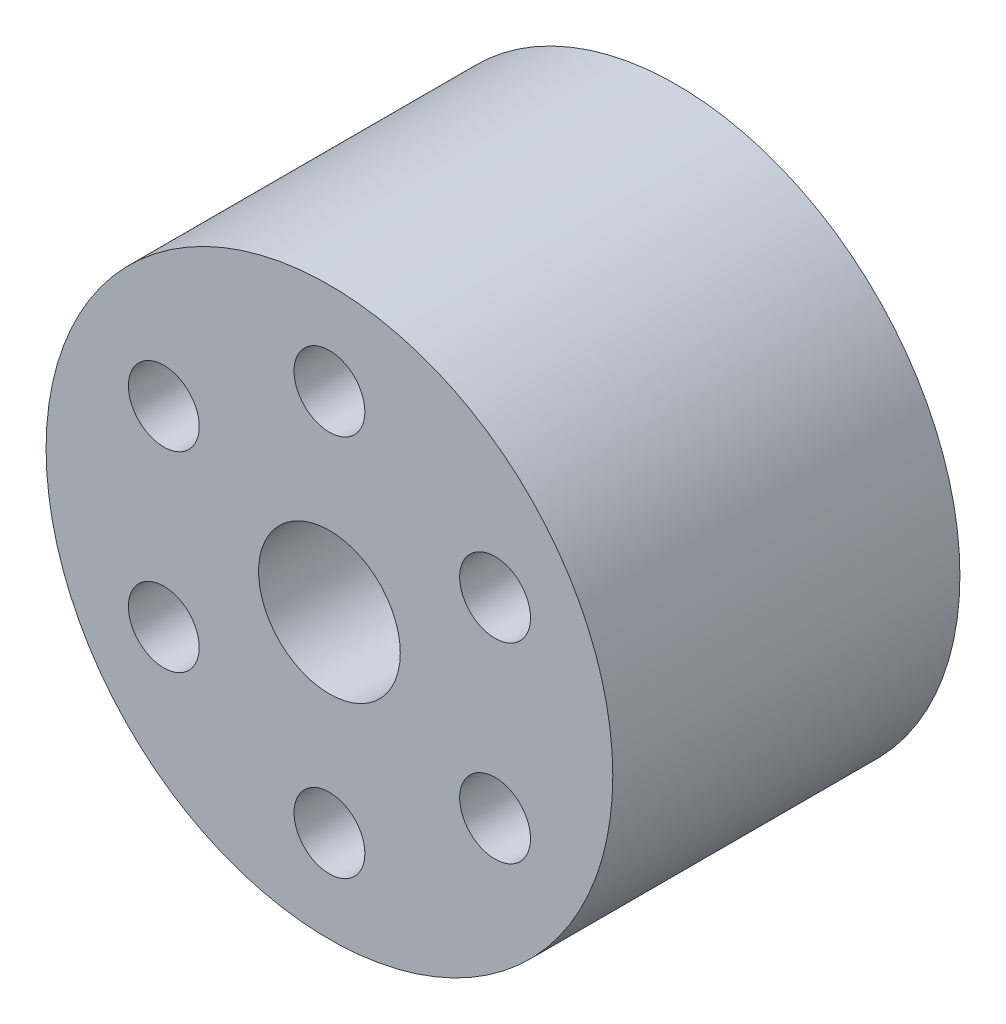
ISO-10303-21;
HEADER;
FILE_DESCRIPTION(('STEP AP214'),'2;1');
FILE_NAME('part.step','',(''),(''),'','','');
FILE_SCHEMA(('AUTOMOTIVE_DESIGN { 1 0 10303 214 1 1 1 1 }'));
ENDSEC;
DATA;
#1=APPLICATION_CONTEXT('core data for automotive mechanical design processes');
#2=APPLICATION_PROTOCOL_DEFINITION('international standard','automotive_design',2000,#1);
#3=PRODUCT_CONTEXT('',#1,'mechanical');
#4=PRODUCT('Part','Part','',(#3));
#5=PRODUCT_RELATED_PRODUCT_CATEGORY('part','',(#4));
#6=PRODUCT_DEFINITION_FORMATION('','',#4);
#7=PRODUCT_DEFINITION_CONTEXT('part definition',#1,'design');
#8=PRODUCT_DEFINITION('design','',#6,#7);
#9=PRODUCT_DEFINITION_SHAPE('','',#8);
#10=(LENGTH_UNIT() NAMED_UNIT(*) SI_UNIT(.MILLI.,.METRE.));
#11=(NAMED_UNIT(*) PLANE_ANGLE_UNIT() SI_UNIT($,.RADIAN.));
#12=(NAMED_UNIT(*) SI_UNIT($,.STERADIAN.) SOLID_ANGLE_UNIT());
#13=UNCERTAINTY_MEASURE_WITH_UNIT(LENGTH_MEASURE(1.E-05),#10,'distance_accuracy_value','');
#14=(GEOMETRIC_REPRESENTATION_CONTEXT(3) GLOBAL_UNCERTAINTY_ASSIGNED_CONTEXT((#13)) GLOBAL_UNIT_ASSIGNED_CONTEXT((#10,
#11,#12)) REPRESENTATION_CONTEXT('',''));
#15=CARTESIAN_POINT('',(0.,0.,0.));
#16=DIRECTION('',(0.,0.,1.));
#17=DIRECTION('',(1.,0.,0.));
#18=AXIS2_PLACEMENT_3D('',#15,#16,#17);
#19=CARTESIAN_POINT('',(0.,0.,24.5));
#20=DIRECTION('',(0.,0.,-1.));
#21=DIRECTION('',(-1.,0.,0.));
#22=AXIS2_PLACEMENT_3D('',#19,#20,#21);
#23=CYLINDRICAL_SURFACE('',#22,20.);
#24=CARTESIAN_POINT('',(0.,0.,24.5));
#25=DIRECTION('',(0.,0.,1.));
#26=DIRECTION('',(1.,0.,0.));
#27=AXIS2_PLACEMENT_3D('',#24,#25,#26);
#28=CIRCLE('',#27,20.);
#29=CARTESIAN_POINT('',(20.,0.,24.5));
#30=VERTEX_POINT('',#29);
#31=EDGE_CURVE('E10',#30,#30,#28,.T.);
#32=ORIENTED_EDGE('',*,*,#31,.F.);
#33=EDGE_LOOP('',(#32));
#34=FACE_BOUND('',#33,.T.);
#35=CARTESIAN_POINT('',(0.,0.,0.));
#36=DIRECTION('',(0.,0.,1.));
#37=DIRECTION('',(1.,0.,0.));
#38=AXIS2_PLACEMENT_3D('',#35,#36,#37);
#39=CIRCLE('',#38,20.);
#40=CARTESIAN_POINT('',(20.,0.,0.));
#41=VERTEX_POINT('',#40);
#42=EDGE_CURVE('E33',#41,#41,#39,.T.);
#43=ORIENTED_EDGE('',*,*,#42,.T.);
#44=EDGE_LOOP('',(#43));
#45=FACE_BOUND('',#44,.T.);
#46=ADVANCED_FACE('F30',(#34,#45),#23,.T.);
#47=CARTESIAN_POINT('',(0.,0.,24.5));
#48=DIRECTION('',(0.,0.,1.));
#49=DIRECTION('',(1.,0.,0.));
#50=AXIS2_PLACEMENT_3D('',#47,#48,#49);
#51=PLANE('',#50);
#52=CARTESIAN_POINT('',(-11.6913429510896,6.74999999999949,24.5));
#53=DIRECTION('',(0.,0.,1.));
#54=DIRECTION('',(1.,0.,0.));
#55=AXIS2_PLACEMENT_3D('',#52,#53,#54);
#56=CIRCLE('',#55,2.50000000000058);
#57=CARTESIAN_POINT('',(-9.19134295108906,6.74999999999949,24.5));
#58=VERTEX_POINT('',#57);
#59=EDGE_CURVE('E84',#58,#58,#56,.T.);
#60=ORIENTED_EDGE('',*,*,#59,.F.);
#61=EDGE_LOOP('',(#60));
#62=FACE_BOUND('',#61,.T.);
#63=CARTESIAN_POINT('',(-11.6913429510891,-6.7500000000005,24.5));
#64=DIRECTION('',(0.,0.,1.));
#65=DIRECTION('',(1.,0.,0.));
#66=AXIS2_PLACEMENT_3D('',#63,#64,#65);
#67=CIRCLE('',#66,2.50000000000109);
#68=CARTESIAN_POINT('',(-9.19134295108796,-6.7500000000005,24.5));
#69=VERTEX_POINT('',#68);
#70=EDGE_CURVE('E78',#69,#69,#67,.T.);
#71=ORIENTED_EDGE('',*,*,#70,.F.);
#72=EDGE_LOOP('',(#71));
#73=FACE_BOUND('',#72,.T.);
#74=CARTESIAN_POINT('',(1.14777268557366E-12,-13.5,24.5));
#75=DIRECTION('',(0.,0.,1.));
#76=DIRECTION('',(1.,0.,0.));
#77=AXIS2_PLACEMENT_3D('',#74,#75,#76);
#78=CIRCLE('',#77,2.50000000000119);
#79=CARTESIAN_POINT('',(2.50000000000234,-13.5,24.5));
#80=VERTEX_POINT('',#79);
#81=EDGE_CURVE('E72',#80,#80,#78,.T.);
#82=ORIENTED_EDGE('',*,*,#81,.F.);
#83=EDGE_LOOP('',(#82));
#84=FACE_BOUND('',#83,.T.);
#85=CARTESIAN_POINT('',(11.6913429510908,-6.7499999999995,24.5));
#86=DIRECTION('',(0.,0.,1.));
#87=DIRECTION('',(1.,0.,0.));
#88=AXIS2_PLACEMENT_3D('',#85,#86,#87);
#89=CIRCLE('',#88,2.50000000000074);
#90=CARTESIAN_POINT('',(14.1913429510915,-6.7499999999995,24.5));
#91=VERTEX_POINT('',#90);
#92=EDGE_CURVE('E66',#91,#91,#89,.T.);
#93=ORIENTED_EDGE('',*,*,#92,.F.);
#94=EDGE_LOOP('',(#93));
#95=FACE_BOUND('',#94,.T.);
#96=CARTESIAN_POINT('',(11.6913429510902,6.7500000000005,24.5));
#97=DIRECTION('',(0.,0.,1.));
#98=DIRECTION('',(1.,0.,0.));
#99=AXIS2_PLACEMENT_3D('',#96,#97,#98);
#100=CIRCLE('',#99,2.50000000000017);
#101=CARTESIAN_POINT('',(14.1913429510904,6.7500000000005,24.5));
#102=VERTEX_POINT('',#101);
#103=EDGE_CURVE('E60',#102,#102,#100,.T.);
#104=ORIENTED_EDGE('',*,*,#103,.F.);
#105=EDGE_LOOP('',(#104));
#106=FACE_BOUND('',#105,.T.);
#107=CARTESIAN_POINT('',(0.,13.5,24.5));
#108=DIRECTION('',(0.,0.,1.));
#109=DIRECTION('',(1.,0.,0.));
#110=AXIS2_PLACEMENT_3D('',#107,#108,#109);
#111=CIRCLE('',#110,2.5);
#112=CARTESIAN_POINT('',(2.5,13.5,24.5));
#113=VERTEX_POINT('',#112);
#114=EDGE_CURVE('E54',#113,#113,#111,.T.);
#115=ORIENTED_EDGE('',*,*,#114,.F.);
#116=EDGE_LOOP('',(#115));
#117=FACE_BOUND('',#116,.T.);
#118=CARTESIAN_POINT('',(0.,0.,24.5));
#119=DIRECTION('',(0.,0.,1.));
#120=DIRECTION('',(1.,0.,0.));
#121=AXIS2_PLACEMENT_3D('',#118,#119,#120);
#122=CIRCLE('',#121,5.);
#123=CARTESIAN_POINT('',(5.,0.,24.5));
#124=VERTEX_POINT('',#123);
#125=EDGE_CURVE('E42',#124,#124,#122,.T.);
#126=ORIENTED_EDGE('',*,*,#125,.F.);
#127=EDGE_LOOP('',(#126));
#128=FACE_BOUND('',#127,.T.);
#129=ORIENTED_EDGE('',*,*,#31,.T.);
#130=EDGE_LOOP('',(#129));
#131=FACE_BOUND('',#130,.T.);
#132=ADVANCED_FACE('F99',(#62,#73,#84,#95,#106,#117,#128,#131),#51,.T.);
#133=CARTESIAN_POINT('',(0.,0.,0.));
#134=DIRECTION('',(0.,0.,1.));
#135=DIRECTION('',(1.,0.,0.));
#136=AXIS2_PLACEMENT_3D('',#133,#134,#135);
#137=PLANE('',#136);
#138=CARTESIAN_POINT('',(0.,0.,0.));
#139=DIRECTION('',(0.,0.,1.));
#140=DIRECTION('',(1.,0.,0.));
#141=AXIS2_PLACEMENT_3D('',#138,#139,#140);
#142=CIRCLE('',#141,4.);
#143=CARTESIAN_POINT('',(4.,0.,0.));
#144=VERTEX_POINT('',#143);
#145=EDGE_CURVE('E45',#144,#144,#142,.T.);
#146=ORIENTED_EDGE('',*,*,#145,.T.);
#147=EDGE_LOOP('',(#146));
#148=FACE_BOUND('',#147,.T.);
#149=ORIENTED_EDGE('',*,*,#42,.F.);
#150=EDGE_LOOP('',(#149));
#151=FACE_BOUND('',#150,.T.);
#152=ADVANCED_FACE('F102',(#148,#151),#137,.F.);
#153=CARTESIAN_POINT('',(0.,0.,14.5));
#154=DIRECTION('',(0.,0.,1.));
#155=DIRECTION('',(1.,0.,0.));
#156=AXIS2_PLACEMENT_3D('',#153,#154,#155);
#157=CYLINDRICAL_SURFACE('',#156,5.);
#158=CARTESIAN_POINT('',(0.,0.,14.5));
#159=DIRECTION('',(0.,0.,1.));
#160=DIRECTION('',(1.,0.,0.));
#161=AXIS2_PLACEMENT_3D('',#158,#159,#160);
#162=CIRCLE('',#161,5.);
#163=CARTESIAN_POINT('',(5.,0.,14.5));
#164=VERTEX_POINT('',#163);
#165=EDGE_CURVE('E40',#164,#164,#162,.T.);
#166=ORIENTED_EDGE('',*,*,#165,.F.);
#167=EDGE_LOOP('',(#166));
#168=FACE_BOUND('',#167,.T.);
#169=ORIENTED_EDGE('',*,*,#125,.T.);
#170=EDGE_LOOP('',(#169));
#171=FACE_BOUND('',#170,.T.);
#172=ADVANCED_FACE('F116',(#168,#171),#157,.F.);
#173=CARTESIAN_POINT('',(0.,0.,14.5));
#174=DIRECTION('',(0.,0.,1.));
#175=DIRECTION('',(1.,0.,0.));
#176=AXIS2_PLACEMENT_3D('',#173,#174,#175);
#177=PLANE('',#176);
#178=CARTESIAN_POINT('',(0.,0.,14.5));
#179=DIRECTION('',(0.,0.,1.));
#180=DIRECTION('',(1.,0.,0.));
#181=AXIS2_PLACEMENT_3D('',#178,#179,#180);
#182=CIRCLE('',#181,4.);
#183=CARTESIAN_POINT('',(4.,0.,14.5));
#184=VERTEX_POINT('',#183);
#185=EDGE_CURVE('E48',#184,#184,#182,.T.);
#186=ORIENTED_EDGE('',*,*,#185,.F.);
#187=EDGE_LOOP('',(#186));
#188=FACE_BOUND('',#187,.T.);
#189=ORIENTED_EDGE('',*,*,#165,.T.);
#190=EDGE_LOOP('',(#189));
#191=FACE_BOUND('',#190,.T.);
#192=ADVANCED_FACE('F118',(#188,#191),#177,.T.);
#193=CARTESIAN_POINT('',(0.,0.,0.));
#194=DIRECTION('',(0.,0.,1.));
#195=DIRECTION('',(1.,0.,0.));
#196=AXIS2_PLACEMENT_3D('',#193,#194,#195);
#197=CYLINDRICAL_SURFACE('',#196,4.);
#198=CARTESIAN_POINT('',(4.,0.,0.));
#199=CARTESIAN_POINT('',(4.,0.,0.151041666666667));
#200=CARTESIAN_POINT('',(4.,0.,0.302083333333333));
#201=CARTESIAN_POINT('',(4.,0.,0.604166666666667));
#202=CARTESIAN_POINT('',(4.,0.,0.755208333333333));
#203=CARTESIAN_POINT('',(4.,0.,1.05729166666667));
#204=CARTESIAN_POINT('',(4.,0.,1.20833333333333));
#205=CARTESIAN_POINT('',(4.,0.,1.51041666666667));
#206=CARTESIAN_POINT('',(4.,0.,1.66145833333333));
#207=CARTESIAN_POINT('',(4.,0.,1.96354166666667));
#208=CARTESIAN_POINT('',(4.,0.,2.11458333333333));
#209=CARTESIAN_POINT('',(4.,0.,2.41666666666667));
#210=CARTESIAN_POINT('',(4.,0.,2.56770833333333));
#211=CARTESIAN_POINT('',(4.,0.,2.86979166666667));
#212=CARTESIAN_POINT('',(4.,0.,3.02083333333333));
#213=CARTESIAN_POINT('',(4.,0.,3.32291666666667));
#214=CARTESIAN_POINT('',(4.,0.,3.47395833333333));
#215=CARTESIAN_POINT('',(4.,0.,3.77604166666667));
#216=CARTESIAN_POINT('',(4.,0.,3.92708333333333));
#217=CARTESIAN_POINT('',(4.,0.,4.22916666666667));
#218=CARTESIAN_POINT('',(4.,0.,4.38020833333333));
#219=CARTESIAN_POINT('',(4.,0.,4.68229166666667));
#220=CARTESIAN_POINT('',(4.,0.,4.83333333333333));
#221=CARTESIAN_POINT('',(4.,0.,5.13541666666667));
#222=CARTESIAN_POINT('',(4.,0.,5.28645833333333));
#223=CARTESIAN_POINT('',(4.,0.,5.58854166666667));
#224=CARTESIAN_POINT('',(4.,0.,5.73958333333333));
#225=CARTESIAN_POINT('',(4.,0.,6.04166666666667));
#226=CARTESIAN_POINT('',(4.,0.,6.19270833333333));
#227=CARTESIAN_POINT('',(4.,0.,6.49479166666667));
#228=CARTESIAN_POINT('',(4.,0.,6.64583333333333));
#229=CARTESIAN_POINT('',(4.,0.,6.94791666666667));
#230=CARTESIAN_POINT('',(4.,0.,7.09895833333333));
#231=CARTESIAN_POINT('',(4.,0.,7.40104166666667));
#232=CARTESIAN_POINT('',(4.,0.,7.55208333333333));
#233=CARTESIAN_POINT('',(4.,0.,7.85416666666667));
#234=CARTESIAN_POINT('',(4.,0.,8.00520833333333));
#235=CARTESIAN_POINT('',(4.,0.,8.30729166666667));
#236=CARTESIAN_POINT('',(4.,0.,8.45833333333333));
#237=CARTESIAN_POINT('',(4.,0.,8.76041666666667));
#238=CARTESIAN_POINT('',(4.,0.,8.91145833333333));
#239=CARTESIAN_POINT('',(4.,0.,9.21354166666667));
#240=CARTESIAN_POINT('',(4.,0.,9.36458333333333));
#241=CARTESIAN_POINT('',(4.,0.,9.66666666666667));
#242=CARTESIAN_POINT('',(4.,0.,9.81770833333333));
#243=CARTESIAN_POINT('',(4.,0.,10.1197916666667));
#244=CARTESIAN_POINT('',(4.,0.,10.2708333333333));
#245=CARTESIAN_POINT('',(4.,0.,10.5729166666667));
#246=CARTESIAN_POINT('',(4.,0.,10.7239583333333));
#247=CARTESIAN_POINT('',(4.,0.,11.0260416666667));
#248=CARTESIAN_POINT('',(4.,0.,11.1770833333333));
#249=CARTESIAN_POINT('',(4.,0.,11.4791666666667));
#250=CARTESIAN_POINT('',(4.,0.,11.6302083333333));
#251=CARTESIAN_POINT('',(4.,0.,11.9322916666667));
#252=CARTESIAN_POINT('',(4.,0.,12.0833333333333));
#253=CARTESIAN_POINT('',(4.,0.,12.3854166666667));
#254=CARTESIAN_POINT('',(4.,0.,12.5364583333333));
#255=CARTESIAN_POINT('',(4.,0.,12.8385416666667));
#256=CARTESIAN_POINT('',(4.,0.,12.9895833333333));
#257=CARTESIAN_POINT('',(4.,0.,13.2916666666667));
#258=CARTESIAN_POINT('',(4.,0.,13.4427083333333));
#259=CARTESIAN_POINT('',(4.,0.,13.7447916666667));
#260=CARTESIAN_POINT('',(4.,0.,13.8958333333333));
#261=CARTESIAN_POINT('',(4.,0.,14.1979166666667));
#262=CARTESIAN_POINT('',(4.,0.,14.3489583333333));
#263=CARTESIAN_POINT('',(4.,0.,14.5));
#264=B_SPLINE_CURVE_WITH_KNOTS('',3,(#198,#199,#200,#201,#202,#203,#204,#205,#206,#207,#208,
#209,#210,#211,#212,#213,#214,#215,#216,#217,#218,#219,#220,#221,#222,#223,#224,#225,#226,#227,
#228,#229,#230,#231,#232,#233,#234,#235,#236,#237,#238,#239,#240,#241,#242,#243,#244,#245,#246,
#247,#248,#249,#250,#251,#252,#253,#254,#255,#256,#257,#258,#259,#260,#261,#262,#263),
.UNSPECIFIED.,.F.,.F.,(4,2,2,2,2,2,2,2,2,2,2,2,2,2,2,2,2,2,2,2,2,2,2,2,2,2,2,2,2,2,2,2,4),(0.,
0.453125,0.90625,1.359375,1.8125,2.265625,2.71875,3.171875,3.625,4.078125,4.53125,4.984375,
5.4375,5.890625,6.34375,6.796875,7.25,7.703125,8.15625,8.609375,9.0625,9.515625,9.96875,
10.421875,10.875,11.328125,11.78125,12.234375,12.6875,13.140625,13.59375,14.046875,14.5),.UNSPECIFIED.);
#265=EDGE_CURVE('BSEAM125',#144,#184,#264,.T.);
#266=ORIENTED_EDGE('',*,*,#145,.F.);
#267=ORIENTED_EDGE('',*,*,#185,.T.);
#268=ORIENTED_EDGE('',*,*,#265,.T.);
#269=ORIENTED_EDGE('',*,*,#265,.F.);
#270=EDGE_LOOP('',(#266,#268,#267,#269));
#271=FACE_BOUND('',#270,.T.);
#272=ADVANCED_FACE('F125',(#271),#197,.F.);
#273=CARTESIAN_POINT('',(0.,13.5,14.5));
#274=DIRECTION('',(0.,0.,1.));
#275=DIRECTION('',(1.,0.,0.));
#276=AXIS2_PLACEMENT_3D('',#273,#274,#275);
#277=CYLINDRICAL_SURFACE('',#276,2.5);
#278=CARTESIAN_POINT('',(0.,13.5,14.5));
#279=DIRECTION('',(0.,0.,1.));
#280=DIRECTION('',(1.,0.,0.));
#281=AXIS2_PLACEMENT_3D('',#278,#279,#280);
#282=CIRCLE('',#281,2.5);
#283=CARTESIAN_POINT('',(2.5,13.5,14.5));
#284=VERTEX_POINT('',#283);
#285=EDGE_CURVE('E51',#284,#284,#282,.T.);
#286=ORIENTED_EDGE('',*,*,#285,.F.);
#287=EDGE_LOOP('',(#286));
#288=FACE_BOUND('',#287,.T.);
#289=ORIENTED_EDGE('',*,*,#114,.T.);
#290=EDGE_LOOP('',(#289));
#291=FACE_BOUND('',#290,.T.);
#292=ADVANCED_FACE('F162',(#288,#291),#277,.F.);
#293=CARTESIAN_POINT('',(0.,13.5,14.5));
#294=DIRECTION('',(0.,0.,1.));
#295=DIRECTION('',(1.,0.,0.));
#296=AXIS2_PLACEMENT_3D('',#293,#294,#295);
#297=PLANE('',#296);
#298=ORIENTED_EDGE('',*,*,#285,.T.);
#299=EDGE_LOOP('',(#298));
#300=FACE_BOUND('',#299,.T.);
#301=ADVANCED_FACE('F172',(#300),#297,.T.);
#302=CARTESIAN_POINT('',(11.6913429510902,6.7500000000005,14.5));
#303=DIRECTION('',(0.,0.,1.));
#304=DIRECTION('',(1.,0.,0.));
#305=AXIS2_PLACEMENT_3D('',#302,#303,#304);
#306=CYLINDRICAL_SURFACE('',#305,2.50000000000017);
#307=CARTESIAN_POINT('',(11.6913429510902,6.7500000000005,14.5));
#308=DIRECTION('',(0.,0.,1.));
#309=DIRECTION('',(1.,0.,0.));
#310=AXIS2_PLACEMENT_3D('',#307,#308,#309);
#311=CIRCLE('',#310,2.50000000000017);
#312=CARTESIAN_POINT('',(14.1913429510904,6.7500000000005,14.5));
#313=VERTEX_POINT('',#312);
#314=EDGE_CURVE('E57',#313,#313,#311,.T.);
#315=ORIENTED_EDGE('',*,*,#314,.F.);
#316=EDGE_LOOP('',(#315));
#317=FACE_BOUND('',#316,.T.);
#318=ORIENTED_EDGE('',*,*,#103,.T.);
#319=EDGE_LOOP('',(#318));
#320=FACE_BOUND('',#319,.T.);
#321=ADVANCED_FACE('F179',(#317,#320),#306,.F.);
#322=CARTESIAN_POINT('',(11.6913429510902,6.7500000000005,14.5));
#323=DIRECTION('',(0.,0.,1.));
#324=DIRECTION('',(1.,0.,0.));
#325=AXIS2_PLACEMENT_3D('',#322,#323,#324);
#326=PLANE('',#325);
#327=ORIENTED_EDGE('',*,*,#314,.T.);
#328=EDGE_LOOP('',(#327));
#329=FACE_BOUND('',#328,.T.);
#330=ADVANCED_FACE('F187',(#329),#326,.T.);
#331=CARTESIAN_POINT('',(11.6913429510908,-6.7499999999995,14.5));
#332=DIRECTION('',(0.,0.,1.));
#333=DIRECTION('',(1.,0.,0.));
#334=AXIS2_PLACEMENT_3D('',#331,#332,#333);
#335=CYLINDRICAL_SURFACE('',#334,2.50000000000074);
#336=CARTESIAN_POINT('',(11.6913429510908,-6.7499999999995,14.5));
#337=DIRECTION('',(0.,0.,1.));
#338=DIRECTION('',(1.,0.,0.));
#339=AXIS2_PLACEMENT_3D('',#336,#337,#338);
#340=CIRCLE('',#339,2.50000000000074);
#341=CARTESIAN_POINT('',(14.1913429510915,-6.7499999999995,14.5));
#342=VERTEX_POINT('',#341);
#343=EDGE_CURVE('E63',#342,#342,#340,.T.);
#344=ORIENTED_EDGE('',*,*,#343,.F.);
#345=EDGE_LOOP('',(#344));
#346=FACE_BOUND('',#345,.T.);
#347=ORIENTED_EDGE('',*,*,#92,.T.);
#348=EDGE_LOOP('',(#347));
#349=FACE_BOUND('',#348,.T.);
#350=ADVANCED_FACE('F195',(#346,#349),#335,.F.);
#351=CARTESIAN_POINT('',(11.6913429510908,-6.7499999999995,14.5));
#352=DIRECTION('',(0.,0.,1.));
#353=DIRECTION('',(1.,0.,0.));
#354=AXIS2_PLACEMENT_3D('',#351,#352,#353);
#355=PLANE('',#354);
#356=ORIENTED_EDGE('',*,*,#343,.T.);
#357=EDGE_LOOP('',(#356));
#358=FACE_BOUND('',#357,.T.);
#359=ADVANCED_FACE('F203',(#358),#355,.T.);
#360=CARTESIAN_POINT('',(1.14777268557366E-12,-13.5,14.5));
#361=DIRECTION('',(0.,0.,1.));
#362=DIRECTION('',(1.,0.,0.));
#363=AXIS2_PLACEMENT_3D('',#360,#361,#362);
#364=CYLINDRICAL_SURFACE('',#363,2.50000000000119);
#365=CARTESIAN_POINT('',(1.14777268557366E-12,-13.5,14.5));
#366=DIRECTION('',(0.,0.,1.));
#367=DIRECTION('',(1.,0.,0.));
#368=AXIS2_PLACEMENT_3D('',#365,#366,#367);
#369=CIRCLE('',#368,2.50000000000119);
#370=CARTESIAN_POINT('',(2.50000000000234,-13.5,14.5));
#371=VERTEX_POINT('',#370);
#372=EDGE_CURVE('E69',#371,#371,#369,.T.);
#373=ORIENTED_EDGE('',*,*,#372,.F.);
#374=EDGE_LOOP('',(#373));
#375=FACE_BOUND('',#374,.T.);
#376=ORIENTED_EDGE('',*,*,#81,.T.);
#377=EDGE_LOOP('',(#376));
#378=FACE_BOUND('',#377,.T.);
#379=ADVANCED_FACE('F211',(#375,#378),#364,.F.);
#380=CARTESIAN_POINT('',(1.14777268557366E-12,-13.5,14.5));
#381=DIRECTION('',(0.,0.,1.));
#382=DIRECTION('',(1.,0.,0.));
#383=AXIS2_PLACEMENT_3D('',#380,#381,#382);
#384=PLANE('',#383);
#385=ORIENTED_EDGE('',*,*,#372,.T.);
#386=EDGE_LOOP('',(#385));
#387=FACE_BOUND('',#386,.T.);
#388=ADVANCED_FACE('F219',(#387),#384,.T.);
#389=CARTESIAN_POINT('',(-11.6913429510891,-6.7500000000005,14.5));
#390=DIRECTION('',(0.,0.,1.));
#391=DIRECTION('',(1.,0.,0.));
#392=AXIS2_PLACEMENT_3D('',#389,#390,#391);
#393=CYLINDRICAL_SURFACE('',#392,2.50000000000109);
#394=CARTESIAN_POINT('',(-11.6913429510891,-6.7500000000005,14.5));
#395=DIRECTION('',(0.,0.,1.));
#396=DIRECTION('',(1.,0.,0.));
#397=AXIS2_PLACEMENT_3D('',#394,#395,#396);
#398=CIRCLE('',#397,2.50000000000109);
#399=CARTESIAN_POINT('',(-9.19134295108796,-6.7500000000005,14.5));
#400=VERTEX_POINT('',#399);
#401=EDGE_CURVE('E75',#400,#400,#398,.T.);
#402=ORIENTED_EDGE('',*,*,#401,.F.);
#403=EDGE_LOOP('',(#402));
#404=FACE_BOUND('',#403,.T.);
#405=ORIENTED_EDGE('',*,*,#70,.T.);
#406=EDGE_LOOP('',(#405));
#407=FACE_BOUND('',#406,.T.);
#408=ADVANCED_FACE('F227',(#404,#407),#393,.F.);
#409=CARTESIAN_POINT('',(-11.6913429510891,-6.7500000000005,14.5));
#410=DIRECTION('',(0.,0.,1.));
#411=DIRECTION('',(1.,0.,0.));
#412=AXIS2_PLACEMENT_3D('',#409,#410,#411);
#413=PLANE('',#412);
#414=ORIENTED_EDGE('',*,*,#401,.T.);
#415=EDGE_LOOP('',(#414));
#416=FACE_BOUND('',#415,.T.);
#417=ADVANCED_FACE('F95',(#416),#413,.T.);
#418=CARTESIAN_POINT('',(-11.6913429510896,6.74999999999949,14.5));
#419=DIRECTION('',(0.,0.,1.));
#420=DIRECTION('',(1.,0.,0.));
#421=AXIS2_PLACEMENT_3D('',#418,#419,#420);
#422=CYLINDRICAL_SURFACE('',#421,2.50000000000058);
#423=CARTESIAN_POINT('',(-11.6913429510896,6.74999999999949,14.5));
#424=DIRECTION('',(0.,0.,1.));
#425=DIRECTION('',(1.,0.,0.));
#426=AXIS2_PLACEMENT_3D('',#423,#424,#425);
#427=CIRCLE('',#426,2.50000000000058);
#428=CARTESIAN_POINT('',(-9.19134295108906,6.74999999999949,14.5));
#429=VERTEX_POINT('',#428);
#430=EDGE_CURVE('E81',#429,#429,#427,.T.);
#431=ORIENTED_EDGE('',*,*,#430,.F.);
#432=EDGE_LOOP('',(#431));
#433=FACE_BOUND('',#432,.T.);
#434=ORIENTED_EDGE('',*,*,#59,.T.);
#435=EDGE_LOOP('',(#434));
#436=FACE_BOUND('',#435,.T.);
#437=ADVANCED_FACE('F92',(#433,#436),#422,.F.);
#438=CARTESIAN_POINT('',(-11.6913429510896,6.74999999999949,14.5));
#439=DIRECTION('',(0.,0.,1.));
#440=DIRECTION('',(1.,0.,0.));
#441=AXIS2_PLACEMENT_3D('',#438,#439,#440);
#442=PLANE('',#441);
#443=ORIENTED_EDGE('',*,*,#430,.T.);
#444=EDGE_LOOP('',(#443));
#445=FACE_BOUND('',#444,.T.);
#446=ADVANCED_FACE('F90',(#445),#442,.T.);
#447=CLOSED_SHELL('',(#46,#132,#152,#172,#192,#272,#292,#301,#321,#330,#350,#359,#379,#388,#408,
#417,#437,#446));
#448=MANIFOLD_SOLID_BREP('B2',#447);
#449=ADVANCED_BREP_SHAPE_REPRESENTATION('',(#18,#448),#14);
#450=SHAPE_DEFINITION_REPRESENTATION(#9,#449);
ENDSEC;
END-ISO-10303-21;
